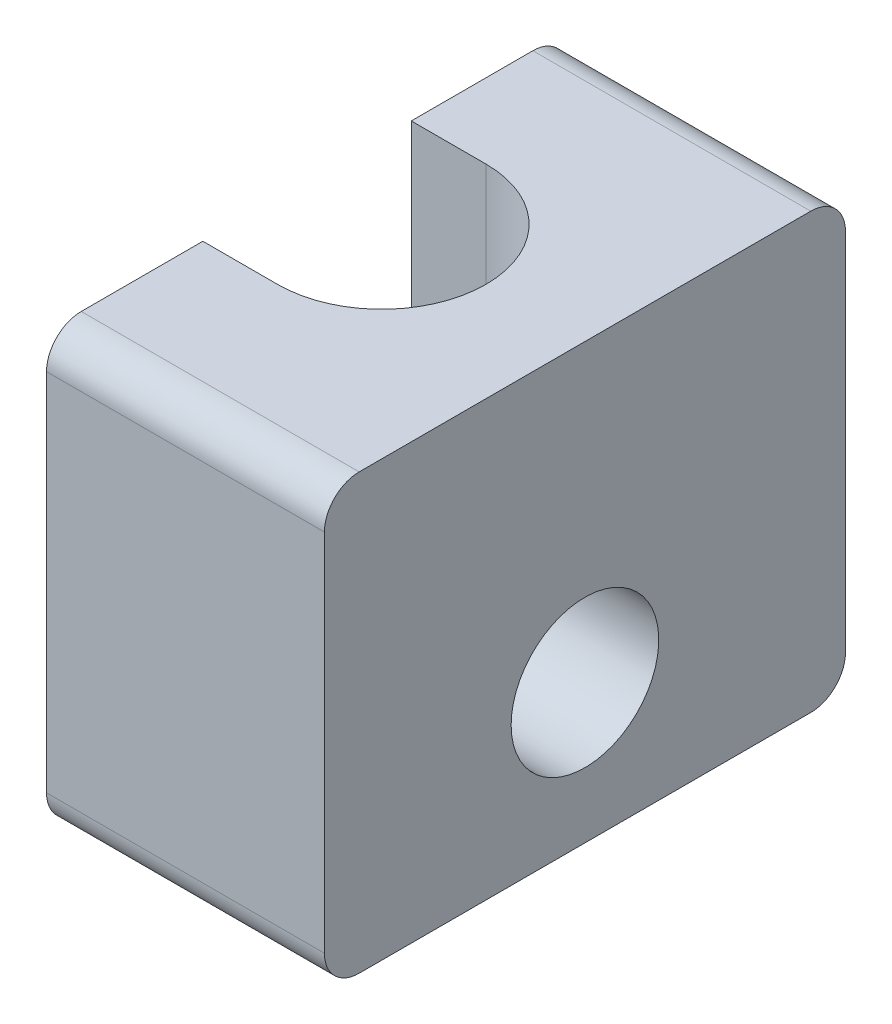
ISO-10303-21;
HEADER;
FILE_DESCRIPTION(('STEP AP214'),'2;1');
FILE_NAME('part.step','',(''),(''),'','','');
FILE_SCHEMA(('AUTOMOTIVE_DESIGN { 1 0 10303 214 1 1 1 1 }'));
ENDSEC;
DATA;
#1=APPLICATION_CONTEXT('core data for automotive mechanical design processes');
#2=APPLICATION_PROTOCOL_DEFINITION('international standard','automotive_design',2000,#1);
#3=PRODUCT_CONTEXT('',#1,'mechanical');
#4=PRODUCT('Part','Part','',(#3));
#5=PRODUCT_RELATED_PRODUCT_CATEGORY('part','',(#4));
#6=PRODUCT_DEFINITION_FORMATION('','',#4);
#7=PRODUCT_DEFINITION_CONTEXT('part definition',#1,'design');
#8=PRODUCT_DEFINITION('design','',#6,#7);
#9=PRODUCT_DEFINITION_SHAPE('','',#8);
#10=(LENGTH_UNIT() NAMED_UNIT(*) SI_UNIT(.MILLI.,.METRE.));
#11=(NAMED_UNIT(*) PLANE_ANGLE_UNIT() SI_UNIT($,.RADIAN.));
#12=(NAMED_UNIT(*) SI_UNIT($,.STERADIAN.) SOLID_ANGLE_UNIT());
#13=UNCERTAINTY_MEASURE_WITH_UNIT(LENGTH_MEASURE(1.E-05),#10,'distance_accuracy_value','');
#14=(GEOMETRIC_REPRESENTATION_CONTEXT(3) GLOBAL_UNCERTAINTY_ASSIGNED_CONTEXT((#13)) GLOBAL_UNIT_ASSIGNED_CONTEXT((#10,
#11,#12)) REPRESENTATION_CONTEXT('',''));
#15=CARTESIAN_POINT('',(0.,0.,0.));
#16=DIRECTION('',(0.,0.,1.));
#17=DIRECTION('',(1.,0.,0.));
#18=AXIS2_PLACEMENT_3D('',#15,#16,#17);
#19=CARTESIAN_POINT('',(8.,25.,-15.));
#20=DIRECTION('',(-1.,0.,0.));
#21=DIRECTION('',(0.,0.,1.));
#22=AXIS2_PLACEMENT_3D('',#19,#20,#21);
#23=PLANE('',#22);
#24=CARTESIAN_POINT('',(8.00000000000001,8.,0.));
#25=DIRECTION('',(-1.,0.,0.));
#26=DIRECTION('',(0.,0.,1.));
#27=AXIS2_PLACEMENT_3D('',#24,#25,#26);
#28=CIRCLE('',#27,4.25);
#29=CARTESIAN_POINT('',(8.00000000000001,8.,4.25));
#30=VERTEX_POINT('',#29);
#31=EDGE_CURVE('E225',#30,#30,#28,.T.);
#32=ORIENTED_EDGE('',*,*,#31,.T.);
#33=EDGE_LOOP('',(#32));
#34=FACE_BOUND('',#33,.T.);
#35=DIRECTION('',(0.,-1.,0.));
#36=VECTOR('',#35,1.);
#37=CARTESIAN_POINT('',(8.,25.,15.));
#38=LINE('',#37,#36);
#39=CARTESIAN_POINT('',(8.,23.,15.));
#40=VERTEX_POINT('',#39);
#41=CARTESIAN_POINT('',(8.,2.,15.));
#42=VERTEX_POINT('',#41);
#43=EDGE_CURVE('E165',#40,#42,#38,.T.);
#44=ORIENTED_EDGE('',*,*,#43,.T.);
#45=CARTESIAN_POINT('',(8.,2.,13.));
#46=DIRECTION('',(-1.,0.,0.));
#47=DIRECTION('',(0.,0.,1.));
#48=AXIS2_PLACEMENT_3D('',#45,#46,#47);
#49=CIRCLE('',#48,2.);
#50=CARTESIAN_POINT('',(8.,0.,13.));
#51=VERTEX_POINT('',#50);
#52=EDGE_CURVE('E191',#42,#51,#49,.F.);
#53=ORIENTED_EDGE('',*,*,#52,.T.);
#54=DIRECTION('',(0.,0.,-1.));
#55=VECTOR('',#54,1.);
#56=CARTESIAN_POINT('',(8.,0.,-15.));
#57=LINE('',#56,#55);
#58=CARTESIAN_POINT('',(8.,0.,-13.));
#59=VERTEX_POINT('',#58);
#60=EDGE_CURVE('E166',#51,#59,#57,.T.);
#61=ORIENTED_EDGE('',*,*,#60,.T.);
#62=CARTESIAN_POINT('',(8.,2.,-13.));
#63=DIRECTION('',(-1.,0.,0.));
#64=DIRECTION('',(0.,0.,1.));
#65=AXIS2_PLACEMENT_3D('',#62,#63,#64);
#66=CIRCLE('',#65,2.);
#67=CARTESIAN_POINT('',(8.,2.,-15.));
#68=VERTEX_POINT('',#67);
#69=EDGE_CURVE('E189',#59,#68,#66,.F.);
#70=ORIENTED_EDGE('',*,*,#69,.T.);
#71=DIRECTION('',(0.,-1.,0.));
#72=VECTOR('',#71,1.);
#73=CARTESIAN_POINT('',(8.,25.,-15.));
#74=LINE('',#73,#72);
#75=CARTESIAN_POINT('',(8.,23.,-15.));
#76=VERTEX_POINT('',#75);
#77=EDGE_CURVE('E138',#76,#68,#74,.T.);
#78=ORIENTED_EDGE('',*,*,#77,.F.);
#79=CARTESIAN_POINT('',(8.,23.,-13.));
#80=DIRECTION('',(-1.,0.,0.));
#81=DIRECTION('',(0.,0.,1.));
#82=AXIS2_PLACEMENT_3D('',#79,#80,#81);
#83=CIRCLE('',#82,2.);
#84=CARTESIAN_POINT('',(8.,25.,-13.));
#85=VERTEX_POINT('',#84);
#86=EDGE_CURVE('E185',#76,#85,#83,.F.);
#87=ORIENTED_EDGE('',*,*,#86,.T.);
#88=DIRECTION('',(0.,0.,-1.));
#89=VECTOR('',#88,1.);
#90=CARTESIAN_POINT('',(8.,25.,-15.));
#91=LINE('',#90,#89);
#92=CARTESIAN_POINT('',(8.,25.,13.));
#93=VERTEX_POINT('',#92);
#94=EDGE_CURVE('E159',#93,#85,#91,.T.);
#95=ORIENTED_EDGE('',*,*,#94,.F.);
#96=CARTESIAN_POINT('',(8.,23.,13.));
#97=DIRECTION('',(-1.,0.,0.));
#98=DIRECTION('',(0.,0.,1.));
#99=AXIS2_PLACEMENT_3D('',#96,#97,#98);
#100=CIRCLE('',#99,2.);
#101=EDGE_CURVE('E187',#93,#40,#100,.F.);
#102=ORIENTED_EDGE('',*,*,#101,.T.);
#103=EDGE_LOOP('',(#44,#53,#61,#70,#78,#87,#95,#102));
#104=FACE_BOUND('',#103,.T.);
#105=ADVANCED_FACE('F35',(#34,#104),#23,.F.);
#106=CARTESIAN_POINT('',(-8.,25.,-15.));
#107=DIRECTION('',(0.,0.,1.));
#108=DIRECTION('',(1.,0.,0.));
#109=AXIS2_PLACEMENT_3D('',#106,#107,#108);
#110=PLANE('',#109);
#111=ORIENTED_EDGE('',*,*,#77,.T.);
#112=DIRECTION('',(-1.,0.,0.));
#113=VECTOR('',#112,1.);
#114=CARTESIAN_POINT('',(-8.,2.,-15.));
#115=LINE('',#114,#113);
#116=CARTESIAN_POINT('',(-8.,2.,-15.));
#117=VERTEX_POINT('',#116);
#118=EDGE_CURVE('E205',#68,#117,#115,.T.);
#119=ORIENTED_EDGE('',*,*,#118,.T.);
#120=DIRECTION('',(0.,-1.,0.));
#121=VECTOR('',#120,1.);
#122=CARTESIAN_POINT('',(-8.,25.,-15.));
#123=LINE('',#122,#121);
#124=CARTESIAN_POINT('',(-8.,23.,-15.));
#125=VERTEX_POINT('',#124);
#126=EDGE_CURVE('E176',#125,#117,#123,.T.);
#127=ORIENTED_EDGE('',*,*,#126,.F.);
#128=DIRECTION('',(-1.,0.,0.));
#129=VECTOR('',#128,1.);
#130=CARTESIAN_POINT('',(8.,23.,-15.));
#131=LINE('',#130,#129);
#132=EDGE_CURVE('E203',#125,#76,#131,.F.);
#133=ORIENTED_EDGE('',*,*,#132,.T.);
#134=EDGE_LOOP('',(#111,#119,#127,#133));
#135=FACE_BOUND('',#134,.T.);
#136=ADVANCED_FACE('F245',(#135),#110,.F.);
#137=CARTESIAN_POINT('',(-8.,25.,-15.));
#138=DIRECTION('',(1.,0.,0.));
#139=DIRECTION('',(0.,0.,-1.));
#140=AXIS2_PLACEMENT_3D('',#137,#138,#139);
#141=PLANE('',#140);
#142=CARTESIAN_POINT('',(-8.,8.,0.));
#143=DIRECTION('',(-1.,0.,0.));
#144=DIRECTION('',(0.,0.,1.));
#145=AXIS2_PLACEMENT_3D('',#142,#143,#144);
#146=CIRCLE('',#145,4.25);
#147=CARTESIAN_POINT('',(-8.,8.,4.25));
#148=VERTEX_POINT('',#147);
#149=EDGE_CURVE('E228',#148,#148,#146,.T.);
#150=ORIENTED_EDGE('',*,*,#149,.F.);
#151=EDGE_LOOP('',(#150));
#152=FACE_BOUND('',#151,.T.);
#153=DIRECTION('',(0.,0.,1.));
#154=VECTOR('',#153,1.);
#155=CARTESIAN_POINT('',(-8.,0.,-15.));
#156=LINE('',#155,#154);
#157=CARTESIAN_POINT('',(-8.,0.,-13.));
#158=VERTEX_POINT('',#157);
#159=CARTESIAN_POINT('',(-8.,0.,13.));
#160=VERTEX_POINT('',#159);
#161=EDGE_CURVE('E162',#158,#160,#156,.T.);
#162=ORIENTED_EDGE('',*,*,#161,.T.);
#163=CARTESIAN_POINT('',(-8.,2.,13.));
#164=DIRECTION('',(1.,0.,0.));
#165=DIRECTION('',(0.,0.,-1.));
#166=AXIS2_PLACEMENT_3D('',#163,#164,#165);
#167=CIRCLE('',#166,2.);
#168=CARTESIAN_POINT('',(-8.,2.,15.));
#169=VERTEX_POINT('',#168);
#170=EDGE_CURVE('E201',#160,#169,#167,.F.);
#171=ORIENTED_EDGE('',*,*,#170,.T.);
#172=DIRECTION('',(0.,-1.,0.));
#173=VECTOR('',#172,1.);
#174=CARTESIAN_POINT('',(-8.,25.,15.));
#175=LINE('',#174,#173);
#176=CARTESIAN_POINT('',(-8.,23.,15.));
#177=VERTEX_POINT('',#176);
#178=EDGE_CURVE('E173',#177,#169,#175,.T.);
#179=ORIENTED_EDGE('',*,*,#178,.F.);
#180=CARTESIAN_POINT('',(-8.,23.,13.));
#181=DIRECTION('',(1.,0.,0.));
#182=DIRECTION('',(0.,0.,-1.));
#183=AXIS2_PLACEMENT_3D('',#180,#181,#182);
#184=CIRCLE('',#183,2.);
#185=CARTESIAN_POINT('',(-8.,25.,13.));
#186=VERTEX_POINT('',#185);
#187=EDGE_CURVE('E50',#177,#186,#184,.F.);
#188=ORIENTED_EDGE('',*,*,#187,.T.);
#189=DIRECTION('',(0.,0.,1.));
#190=VECTOR('',#189,1.);
#191=CARTESIAN_POINT('',(-8.,25.,-15.));
#192=LINE('',#191,#190);
#193=CARTESIAN_POINT('',(-8.,25.,6.));
#194=VERTEX_POINT('',#193);
#195=EDGE_CURVE('E152',#194,#186,#192,.T.);
#196=ORIENTED_EDGE('',*,*,#195,.F.);
#197=DIRECTION('',(0.,1.,0.));
#198=VECTOR('',#197,1.);
#199=CARTESIAN_POINT('',(-8.,15.,6.));
#200=LINE('',#199,#198);
#201=CARTESIAN_POINT('',(-8.,15.,6.));
#202=VERTEX_POINT('',#201);
#203=EDGE_CURVE('E143',#202,#194,#200,.T.);
#204=ORIENTED_EDGE('',*,*,#203,.F.);
#205=DIRECTION('',(0.,0.,1.));
#206=VECTOR('',#205,1.);
#207=CARTESIAN_POINT('',(-8.,15.,-15.));
#208=LINE('',#207,#206);
#209=CARTESIAN_POINT('',(-8.,15.,-6.));
#210=VERTEX_POINT('',#209);
#211=EDGE_CURVE('E128',#210,#202,#208,.T.);
#212=ORIENTED_EDGE('',*,*,#211,.F.);
#213=DIRECTION('',(0.,1.,0.));
#214=VECTOR('',#213,1.);
#215=CARTESIAN_POINT('',(-8.,15.,-6.));
#216=LINE('',#215,#214);
#217=CARTESIAN_POINT('',(-8.,25.,-6.));
#218=VERTEX_POINT('',#217);
#219=EDGE_CURVE('E169',#210,#218,#216,.T.);
#220=ORIENTED_EDGE('',*,*,#219,.T.);
#221=CARTESIAN_POINT('',(-8.,25.,-13.));
#222=VERTEX_POINT('',#221);
#223=EDGE_CURVE('E163',#222,#218,#192,.T.);
#224=ORIENTED_EDGE('',*,*,#223,.F.);
#225=CARTESIAN_POINT('',(-8.,23.,-13.));
#226=DIRECTION('',(1.,0.,0.));
#227=DIRECTION('',(0.,0.,-1.));
#228=AXIS2_PLACEMENT_3D('',#225,#226,#227);
#229=CIRCLE('',#228,2.);
#230=EDGE_CURVE('E197',#222,#125,#229,.F.);
#231=ORIENTED_EDGE('',*,*,#230,.T.);
#232=ORIENTED_EDGE('',*,*,#126,.T.);
#233=CARTESIAN_POINT('',(-8.,2.,-13.));
#234=DIRECTION('',(1.,0.,0.));
#235=DIRECTION('',(0.,0.,-1.));
#236=AXIS2_PLACEMENT_3D('',#233,#234,#235);
#237=CIRCLE('',#236,2.);
#238=EDGE_CURVE('E58',#117,#158,#237,.F.);
#239=ORIENTED_EDGE('',*,*,#238,.T.);
#240=EDGE_LOOP('',(#162,#171,#179,#188,#196,#204,#212,#220,#224,#231,#232,#239));
#241=FACE_BOUND('',#240,.T.);
#242=ADVANCED_FACE('F151',(#152,#241),#141,.F.);
#243=CARTESIAN_POINT('',(-8.,25.,15.));
#244=DIRECTION('',(0.,0.,-1.));
#245=DIRECTION('',(-1.,0.,0.));
#246=AXIS2_PLACEMENT_3D('',#243,#244,#245);
#247=PLANE('',#246);
#248=ORIENTED_EDGE('',*,*,#178,.T.);
#249=DIRECTION('',(1.,0.,0.));
#250=VECTOR('',#249,1.);
#251=CARTESIAN_POINT('',(-8.,2.,15.));
#252=LINE('',#251,#250);
#253=EDGE_CURVE('E182',#169,#42,#252,.T.);
#254=ORIENTED_EDGE('',*,*,#253,.T.);
#255=ORIENTED_EDGE('',*,*,#43,.F.);
#256=DIRECTION('',(1.,0.,0.));
#257=VECTOR('',#256,1.);
#258=CARTESIAN_POINT('',(-8.,23.,15.));
#259=LINE('',#258,#257);
#260=EDGE_CURVE('E137',#40,#177,#259,.F.);
#261=ORIENTED_EDGE('',*,*,#260,.T.);
#262=EDGE_LOOP('',(#248,#254,#255,#261));
#263=FACE_BOUND('',#262,.T.);
#264=ADVANCED_FACE('F244',(#263),#247,.F.);
#265=CARTESIAN_POINT('',(0.,25.,0.));
#266=DIRECTION('',(0.,1.,0.));
#267=DIRECTION('',(0.,0.,1.));
#268=AXIS2_PLACEMENT_3D('',#265,#266,#267);
#269=PLANE('',#268);
#270=ORIENTED_EDGE('',*,*,#195,.T.);
#271=DIRECTION('',(1.,0.,0.));
#272=VECTOR('',#271,1.);
#273=CARTESIAN_POINT('',(8.,25.,13.));
#274=LINE('',#273,#272);
#275=EDGE_CURVE('E11',#186,#93,#274,.T.);
#276=ORIENTED_EDGE('',*,*,#275,.T.);
#277=ORIENTED_EDGE('',*,*,#94,.T.);
#278=DIRECTION('',(-1.,0.,0.));
#279=VECTOR('',#278,1.);
#280=CARTESIAN_POINT('',(-8.,25.,-13.));
#281=LINE('',#280,#279);
#282=EDGE_CURVE('E43',#85,#222,#281,.T.);
#283=ORIENTED_EDGE('',*,*,#282,.T.);
#284=ORIENTED_EDGE('',*,*,#223,.T.);
#285=DIRECTION('',(-1.,0.,0.));
#286=VECTOR('',#285,1.);
#287=CARTESIAN_POINT('',(-8.,25.,-6.));
#288=LINE('',#287,#286);
#289=CARTESIAN_POINT('',(-3.7,25.,-6.));
#290=VERTEX_POINT('',#289);
#291=EDGE_CURVE('E148',#290,#218,#288,.T.);
#292=ORIENTED_EDGE('',*,*,#291,.F.);
#293=CARTESIAN_POINT('',(-3.7,25.,0.));
#294=DIRECTION('',(0.,1.,0.));
#295=DIRECTION('',(0.,0.,1.));
#296=AXIS2_PLACEMENT_3D('',#293,#294,#295);
#297=CIRCLE('',#296,6.);
#298=CARTESIAN_POINT('',(-3.7,25.,6.));
#299=VERTEX_POINT('',#298);
#300=EDGE_CURVE('E221',#299,#290,#297,.T.);
#301=ORIENTED_EDGE('',*,*,#300,.F.);
#302=DIRECTION('',(1.,0.,0.));
#303=VECTOR('',#302,1.);
#304=CARTESIAN_POINT('',(-8.,25.,6.));
#305=LINE('',#304,#303);
#306=EDGE_CURVE('E224',#194,#299,#305,.T.);
#307=ORIENTED_EDGE('',*,*,#306,.F.);
#308=EDGE_LOOP('',(#270,#276,#277,#283,#284,#292,#301,#307));
#309=FACE_BOUND('',#308,.T.);
#310=ADVANCED_FACE('F210',(#309),#269,.T.);
#311=CARTESIAN_POINT('',(0.,0.,0.));
#312=DIRECTION('',(0.,1.,0.));
#313=DIRECTION('',(0.,0.,1.));
#314=AXIS2_PLACEMENT_3D('',#311,#312,#313);
#315=PLANE('',#314);
#316=ORIENTED_EDGE('',*,*,#60,.F.);
#317=DIRECTION('',(1.,0.,0.));
#318=VECTOR('',#317,1.);
#319=CARTESIAN_POINT('',(0.,0.,13.));
#320=LINE('',#319,#318);
#321=EDGE_CURVE('E195',#51,#160,#320,.F.);
#322=ORIENTED_EDGE('',*,*,#321,.T.);
#323=ORIENTED_EDGE('',*,*,#161,.F.);
#324=DIRECTION('',(-1.,0.,0.));
#325=VECTOR('',#324,1.);
#326=CARTESIAN_POINT('',(0.,0.,-13.));
#327=LINE('',#326,#325);
#328=EDGE_CURVE('E193',#158,#59,#327,.F.);
#329=ORIENTED_EDGE('',*,*,#328,.T.);
#330=EDGE_LOOP('',(#316,#322,#323,#329));
#331=FACE_BOUND('',#330,.T.);
#332=ADVANCED_FACE('F280',(#331),#315,.F.);
#333=CARTESIAN_POINT('',(-8.,15.,0.));
#334=DIRECTION('',(0.,1.,0.));
#335=DIRECTION('',(0.,0.,1.));
#336=AXIS2_PLACEMENT_3D('',#333,#334,#335);
#337=PLANE('',#336);
#338=ORIENTED_EDGE('',*,*,#211,.T.);
#339=DIRECTION('',(1.,0.,0.));
#340=VECTOR('',#339,1.);
#341=CARTESIAN_POINT('',(-8.,15.,6.));
#342=LINE('',#341,#340);
#343=CARTESIAN_POINT('',(-3.7,15.,6.));
#344=VERTEX_POINT('',#343);
#345=EDGE_CURVE('E132',#202,#344,#342,.T.);
#346=ORIENTED_EDGE('',*,*,#345,.T.);
#347=CARTESIAN_POINT('',(-3.7,15.,0.));
#348=DIRECTION('',(0.,1.,0.));
#349=DIRECTION('',(0.,0.,1.));
#350=AXIS2_PLACEMENT_3D('',#347,#348,#349);
#351=CIRCLE('',#350,6.);
#352=CARTESIAN_POINT('',(-3.7,15.,-6.));
#353=VERTEX_POINT('',#352);
#354=EDGE_CURVE('E147',#344,#353,#351,.T.);
#355=ORIENTED_EDGE('',*,*,#354,.T.);
#356=DIRECTION('',(-1.,0.,0.));
#357=VECTOR('',#356,1.);
#358=CARTESIAN_POINT('',(-8.,15.,-6.));
#359=LINE('',#358,#357);
#360=EDGE_CURVE('E134',#353,#210,#359,.T.);
#361=ORIENTED_EDGE('',*,*,#360,.T.);
#362=EDGE_LOOP('',(#338,#346,#355,#361));
#363=FACE_BOUND('',#362,.T.);
#364=ADVANCED_FACE('F130',(#363),#337,.T.);
#365=CARTESIAN_POINT('',(-8.,15.,-6.));
#366=DIRECTION('',(0.,0.,-1.));
#367=DIRECTION('',(-1.,0.,0.));
#368=AXIS2_PLACEMENT_3D('',#365,#366,#367);
#369=PLANE('',#368);
#370=ORIENTED_EDGE('',*,*,#291,.T.);
#371=ORIENTED_EDGE('',*,*,#219,.F.);
#372=ORIENTED_EDGE('',*,*,#360,.F.);
#373=DIRECTION('',(0.,1.,0.));
#374=VECTOR('',#373,1.);
#375=CARTESIAN_POINT('',(-3.7,15.,-6.));
#376=LINE('',#375,#374);
#377=EDGE_CURVE('E154',#353,#290,#376,.T.);
#378=ORIENTED_EDGE('',*,*,#377,.T.);
#379=EDGE_LOOP('',(#370,#371,#372,#378));
#380=FACE_BOUND('',#379,.T.);
#381=ADVANCED_FACE('F290',(#380),#369,.F.);
#382=CARTESIAN_POINT('',(-3.7,15.,0.));
#383=DIRECTION('',(0.,1.,0.));
#384=DIRECTION('',(0.,0.,1.));
#385=AXIS2_PLACEMENT_3D('',#382,#383,#384);
#386=CYLINDRICAL_SURFACE('',#385,6.);
#387=ORIENTED_EDGE('',*,*,#300,.T.);
#388=ORIENTED_EDGE('',*,*,#377,.F.);
#389=ORIENTED_EDGE('',*,*,#354,.F.);
#390=DIRECTION('',(0.,1.,0.));
#391=VECTOR('',#390,1.);
#392=CARTESIAN_POINT('',(-3.7,15.,6.));
#393=LINE('',#392,#391);
#394=EDGE_CURVE('E145',#344,#299,#393,.T.);
#395=ORIENTED_EDGE('',*,*,#394,.T.);
#396=EDGE_LOOP('',(#387,#388,#389,#395));
#397=FACE_BOUND('',#396,.T.);
#398=ADVANCED_FACE('F296',(#397),#386,.F.);
#399=CARTESIAN_POINT('',(-8.,15.,6.));
#400=DIRECTION('',(0.,0.,1.));
#401=DIRECTION('',(1.,0.,0.));
#402=AXIS2_PLACEMENT_3D('',#399,#400,#401);
#403=PLANE('',#402);
#404=ORIENTED_EDGE('',*,*,#306,.T.);
#405=ORIENTED_EDGE('',*,*,#394,.F.);
#406=ORIENTED_EDGE('',*,*,#345,.F.);
#407=ORIENTED_EDGE('',*,*,#203,.T.);
#408=EDGE_LOOP('',(#404,#405,#406,#407));
#409=FACE_BOUND('',#408,.T.);
#410=ADVANCED_FACE('F142',(#409),#403,.F.);
#411=CARTESIAN_POINT('',(8.00000000000001,8.,0.));
#412=DIRECTION('',(-1.,0.,0.));
#413=DIRECTION('',(0.,0.,1.));
#414=AXIS2_PLACEMENT_3D('',#411,#412,#413);
#415=CYLINDRICAL_SURFACE('',#414,4.25);
#416=ORIENTED_EDGE('',*,*,#31,.F.);
#417=EDGE_LOOP('',(#416));
#418=FACE_BOUND('',#417,.T.);
#419=ORIENTED_EDGE('',*,*,#149,.T.);
#420=EDGE_LOOP('',(#419));
#421=FACE_BOUND('',#420,.T.);
#422=ADVANCED_FACE('F236',(#418,#421),#415,.F.);
#423=CARTESIAN_POINT('',(-8.,2.,13.));
#424=DIRECTION('',(1.,0.,0.));
#425=DIRECTION('',(0.,0.,-1.));
#426=AXIS2_PLACEMENT_3D('',#423,#424,#425);
#427=CYLINDRICAL_SURFACE('',#426,2.);
#428=ORIENTED_EDGE('',*,*,#170,.F.);
#429=ORIENTED_EDGE('',*,*,#321,.F.);
#430=ORIENTED_EDGE('',*,*,#52,.F.);
#431=ORIENTED_EDGE('',*,*,#253,.F.);
#432=EDGE_LOOP('',(#428,#429,#430,#431));
#433=FACE_BOUND('',#432,.T.);
#434=ADVANCED_FACE('F239',(#433),#427,.T.);
#435=CARTESIAN_POINT('',(-8.,2.,-13.));
#436=DIRECTION('',(-1.,0.,0.));
#437=DIRECTION('',(0.,0.,1.));
#438=AXIS2_PLACEMENT_3D('',#435,#436,#437);
#439=CYLINDRICAL_SURFACE('',#438,2.);
#440=ORIENTED_EDGE('',*,*,#69,.F.);
#441=ORIENTED_EDGE('',*,*,#328,.F.);
#442=ORIENTED_EDGE('',*,*,#238,.F.);
#443=ORIENTED_EDGE('',*,*,#118,.F.);
#444=EDGE_LOOP('',(#440,#441,#442,#443));
#445=FACE_BOUND('',#444,.T.);
#446=ADVANCED_FACE('F262',(#445),#439,.T.);
#447=CARTESIAN_POINT('',(0.,23.,13.));
#448=DIRECTION('',(-1.,0.,0.));
#449=DIRECTION('',(0.,0.,1.));
#450=AXIS2_PLACEMENT_3D('',#447,#448,#449);
#451=CYLINDRICAL_SURFACE('',#450,2.);
#452=ORIENTED_EDGE('',*,*,#187,.F.);
#453=ORIENTED_EDGE('',*,*,#260,.F.);
#454=ORIENTED_EDGE('',*,*,#101,.F.);
#455=ORIENTED_EDGE('',*,*,#275,.F.);
#456=EDGE_LOOP('',(#452,#453,#454,#455));
#457=FACE_BOUND('',#456,.T.);
#458=ADVANCED_FACE('F265',(#457),#451,.T.);
#459=CARTESIAN_POINT('',(0.,23.,-13.));
#460=DIRECTION('',(1.,0.,0.));
#461=DIRECTION('',(0.,0.,-1.));
#462=AXIS2_PLACEMENT_3D('',#459,#460,#461);
#463=CYLINDRICAL_SURFACE('',#462,2.);
#464=ORIENTED_EDGE('',*,*,#86,.F.);
#465=ORIENTED_EDGE('',*,*,#132,.F.);
#466=ORIENTED_EDGE('',*,*,#230,.F.);
#467=ORIENTED_EDGE('',*,*,#282,.F.);
#468=EDGE_LOOP('',(#464,#465,#466,#467));
#469=FACE_BOUND('',#468,.T.);
#470=ADVANCED_FACE('F37',(#469),#463,.T.);
#471=CLOSED_SHELL('',(#105,#136,#242,#264,#310,#332,#364,#381,#398,#410,#422,#434,#446,#458,#470));
#472=MANIFOLD_SOLID_BREP('B2',#471);
#473=ADVANCED_BREP_SHAPE_REPRESENTATION('',(#18,#472),#14);
#474=SHAPE_DEFINITION_REPRESENTATION(#9,#473);
ENDSEC;
END-ISO-10303-21;
